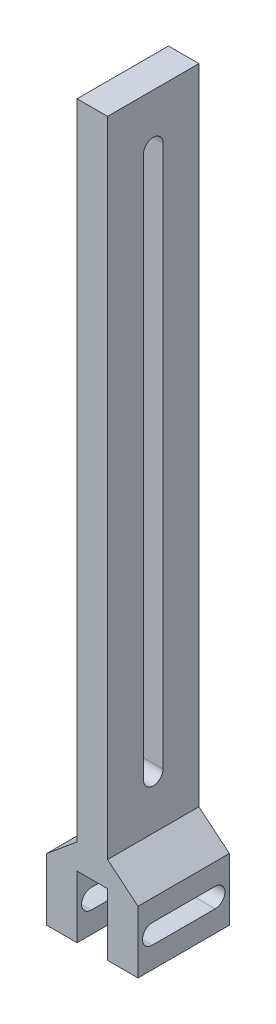
ISO-10303-21;
HEADER;
FILE_DESCRIPTION(('STEP AP214'),'2;1');
FILE_NAME('part.step','',(''),(''),'','','');
FILE_SCHEMA(('AUTOMOTIVE_DESIGN { 1 0 10303 214 1 1 1 1 }'));
ENDSEC;
DATA;
#1=APPLICATION_CONTEXT('core data for automotive mechanical design processes');
#2=APPLICATION_PROTOCOL_DEFINITION('international standard','automotive_design',2000,#1);
#3=PRODUCT_CONTEXT('',#1,'mechanical');
#4=PRODUCT('Part','Part','',(#3));
#5=PRODUCT_RELATED_PRODUCT_CATEGORY('part','',(#4));
#6=PRODUCT_DEFINITION_FORMATION('','',#4);
#7=PRODUCT_DEFINITION_CONTEXT('part definition',#1,'design');
#8=PRODUCT_DEFINITION('design','',#6,#7);
#9=PRODUCT_DEFINITION_SHAPE('','',#8);
#10=(LENGTH_UNIT() NAMED_UNIT(*) SI_UNIT(.MILLI.,.METRE.));
#11=(NAMED_UNIT(*) PLANE_ANGLE_UNIT() SI_UNIT($,.RADIAN.));
#12=(NAMED_UNIT(*) SI_UNIT($,.STERADIAN.) SOLID_ANGLE_UNIT());
#13=UNCERTAINTY_MEASURE_WITH_UNIT(LENGTH_MEASURE(1.E-05),#10,'distance_accuracy_value','');
#14=(GEOMETRIC_REPRESENTATION_CONTEXT(3) GLOBAL_UNCERTAINTY_ASSIGNED_CONTEXT((#13)) GLOBAL_UNIT_ASSIGNED_CONTEXT((#10,
#11,#12)) REPRESENTATION_CONTEXT('',''));
#15=CARTESIAN_POINT('',(0.,0.,0.));
#16=DIRECTION('',(0.,0.,1.));
#17=DIRECTION('',(1.,0.,0.));
#18=AXIS2_PLACEMENT_3D('',#15,#16,#17);
#19=CARTESIAN_POINT('',(-7.5,0.,7.5));
#20=DIRECTION('',(1.,0.,0.));
#21=DIRECTION('',(0.,0.,-1.));
#22=AXIS2_PLACEMENT_3D('',#19,#20,#21);
#23=PLANE('',#22);
#24=DIRECTION('',(0.,0.,1.));
#25=VECTOR('',#24,1.);
#26=CARTESIAN_POINT('',(-7.5,3.5,-5.16429513278029));
#27=LINE('',#26,#25);
#28=CARTESIAN_POINT('',(-7.5,3.5,-5.16429513278029));
#29=VERTEX_POINT('',#28);
#30=CARTESIAN_POINT('',(-7.5,3.5,5.16429513278028));
#31=VERTEX_POINT('',#30);
#32=EDGE_CURVE('E237',#29,#31,#27,.T.);
#33=ORIENTED_EDGE('',*,*,#32,.F.);
#34=CARTESIAN_POINT('',(-7.5,5.1,-5.16429513278029));
#35=DIRECTION('',(-1.,0.,0.));
#36=DIRECTION('',(0.,0.,1.));
#37=AXIS2_PLACEMENT_3D('',#34,#35,#36);
#38=CIRCLE('',#37,1.6);
#39=CARTESIAN_POINT('',(-7.5,6.7,-5.16429513278029));
#40=VERTEX_POINT('',#39);
#41=EDGE_CURVE('E235',#40,#29,#38,.T.);
#42=ORIENTED_EDGE('',*,*,#41,.F.);
#43=DIRECTION('',(0.,0.,-1.));
#44=VECTOR('',#43,1.);
#45=CARTESIAN_POINT('',(-7.5,6.7,-5.16429513278029));
#46=LINE('',#45,#44);
#47=CARTESIAN_POINT('',(-7.5,6.7,5.16429513278028));
#48=VERTEX_POINT('',#47);
#49=EDGE_CURVE('E243',#48,#40,#46,.T.);
#50=ORIENTED_EDGE('',*,*,#49,.F.);
#51=CARTESIAN_POINT('',(-7.5,5.1,5.16429513278029));
#52=DIRECTION('',(-1.,0.,0.));
#53=DIRECTION('',(0.,0.,1.));
#54=AXIS2_PLACEMENT_3D('',#51,#52,#53);
#55=CIRCLE('',#54,1.6);
#56=EDGE_CURVE('E240',#31,#48,#55,.T.);
#57=ORIENTED_EDGE('',*,*,#56,.F.);
#58=EDGE_LOOP('',(#33,#42,#50,#57));
#59=FACE_BOUND('',#58,.T.);
#60=DIRECTION('',(0.,-1.,0.));
#61=VECTOR('',#60,1.);
#62=CARTESIAN_POINT('',(-7.5,0.,-7.5));
#63=LINE('',#62,#61);
#64=CARTESIAN_POINT('',(-7.5,10.2,-7.5));
#65=VERTEX_POINT('',#64);
#66=CARTESIAN_POINT('',(-7.5,0.,-7.5));
#67=VERTEX_POINT('',#66);
#68=EDGE_CURVE('E283',#65,#67,#63,.T.);
#69=ORIENTED_EDGE('',*,*,#68,.T.);
#70=DIRECTION('',(0.,0.,-1.));
#71=VECTOR('',#70,1.);
#72=CARTESIAN_POINT('',(-7.5,0.,7.5));
#73=LINE('',#72,#71);
#74=CARTESIAN_POINT('',(-7.5,0.,7.5));
#75=VERTEX_POINT('',#74);
#76=EDGE_CURVE('E366',#75,#67,#73,.T.);
#77=ORIENTED_EDGE('',*,*,#76,.F.);
#78=DIRECTION('',(0.,-1.,0.));
#79=VECTOR('',#78,1.);
#80=CARTESIAN_POINT('',(-7.5,0.,7.5));
#81=LINE('',#80,#79);
#82=CARTESIAN_POINT('',(-7.5,10.2,7.5));
#83=VERTEX_POINT('',#82);
#84=EDGE_CURVE('E284',#83,#75,#81,.T.);
#85=ORIENTED_EDGE('',*,*,#84,.F.);
#86=DIRECTION('',(0.,0.,-1.));
#87=VECTOR('',#86,1.);
#88=CARTESIAN_POINT('',(-7.5,10.2,7.5));
#89=LINE('',#88,#87);
#90=EDGE_CURVE('E310',#83,#65,#89,.T.);
#91=ORIENTED_EDGE('',*,*,#90,.T.);
#92=EDGE_LOOP('',(#69,#77,#85,#91));
#93=FACE_BOUND('',#92,.T.);
#94=ADVANCED_FACE('F38',(#59,#93),#23,.F.);
#95=CARTESIAN_POINT('',(-7.5,0.,7.5));
#96=DIRECTION('',(0.,1.,0.));
#97=DIRECTION('',(0.,0.,1.));
#98=AXIS2_PLACEMENT_3D('',#95,#96,#97);
#99=PLANE('',#98);
#100=DIRECTION('',(1.,0.,0.));
#101=VECTOR('',#100,1.);
#102=CARTESIAN_POINT('',(-7.5,0.,-7.5));
#103=LINE('',#102,#101);
#104=CARTESIAN_POINT('',(-2.5,0.,-7.5));
#105=VERTEX_POINT('',#104);
#106=EDGE_CURVE('E313',#67,#105,#103,.T.);
#107=ORIENTED_EDGE('',*,*,#106,.T.);
#108=DIRECTION('',(0.,0.,-1.));
#109=VECTOR('',#108,1.);
#110=CARTESIAN_POINT('',(-2.5,0.,7.5));
#111=LINE('',#110,#109);
#112=CARTESIAN_POINT('',(-2.5,0.,7.5));
#113=VERTEX_POINT('',#112);
#114=EDGE_CURVE('E363',#113,#105,#111,.T.);
#115=ORIENTED_EDGE('',*,*,#114,.F.);
#116=DIRECTION('',(1.,0.,0.));
#117=VECTOR('',#116,1.);
#118=CARTESIAN_POINT('',(-7.5,0.,7.5));
#119=LINE('',#118,#117);
#120=EDGE_CURVE('E287',#75,#113,#119,.T.);
#121=ORIENTED_EDGE('',*,*,#120,.F.);
#122=ORIENTED_EDGE('',*,*,#76,.T.);
#123=EDGE_LOOP('',(#107,#115,#121,#122));
#124=FACE_BOUND('',#123,.T.);
#125=ADVANCED_FACE('F416',(#124),#99,.F.);
#126=CARTESIAN_POINT('',(-2.5,0.,7.5));
#127=DIRECTION('',(-1.,0.,0.));
#128=DIRECTION('',(0.,0.,1.));
#129=AXIS2_PLACEMENT_3D('',#126,#127,#128);
#130=PLANE('',#129);
#131=DIRECTION('',(0.,0.,-1.));
#132=VECTOR('',#131,1.);
#133=CARTESIAN_POINT('',(-2.5,6.7,7.5));
#134=LINE('',#133,#132);
#135=CARTESIAN_POINT('',(-2.5,6.7,5.16429513278028));
#136=VERTEX_POINT('',#135);
#137=CARTESIAN_POINT('',(-2.5,6.7,-5.16429513278029));
#138=VERTEX_POINT('',#137);
#139=EDGE_CURVE('E274',#136,#138,#134,.T.);
#140=ORIENTED_EDGE('',*,*,#139,.T.);
#141=CARTESIAN_POINT('',(-2.5,5.1,-5.16429513278029));
#142=DIRECTION('',(-1.,0.,0.));
#143=DIRECTION('',(0.,0.,1.));
#144=AXIS2_PLACEMENT_3D('',#141,#142,#143);
#145=CIRCLE('',#144,1.6);
#146=CARTESIAN_POINT('',(-2.5,3.5,-5.16429513278029));
#147=VERTEX_POINT('',#146);
#148=EDGE_CURVE('E280',#138,#147,#145,.T.);
#149=ORIENTED_EDGE('',*,*,#148,.T.);
#150=DIRECTION('',(0.,0.,1.));
#151=VECTOR('',#150,1.);
#152=CARTESIAN_POINT('',(-2.5,3.5,7.5));
#153=LINE('',#152,#151);
#154=CARTESIAN_POINT('',(-2.5,3.5,5.16429513278028));
#155=VERTEX_POINT('',#154);
#156=EDGE_CURVE('E262',#147,#155,#153,.T.);
#157=ORIENTED_EDGE('',*,*,#156,.T.);
#158=CARTESIAN_POINT('',(-2.5,5.1,5.16429513278029));
#159=DIRECTION('',(-1.,0.,0.));
#160=DIRECTION('',(0.,0.,1.));
#161=AXIS2_PLACEMENT_3D('',#158,#159,#160);
#162=CIRCLE('',#161,1.6);
#163=EDGE_CURVE('E268',#155,#136,#162,.T.);
#164=ORIENTED_EDGE('',*,*,#163,.T.);
#165=EDGE_LOOP('',(#140,#149,#157,#164));
#166=FACE_BOUND('',#165,.T.);
#167=DIRECTION('',(0.,1.,0.));
#168=VECTOR('',#167,1.);
#169=CARTESIAN_POINT('',(-2.5,0.,-7.5));
#170=LINE('',#169,#168);
#171=CARTESIAN_POINT('',(-2.5,10.2,-7.5));
#172=VERTEX_POINT('',#171);
#173=EDGE_CURVE('E315',#105,#172,#170,.T.);
#174=ORIENTED_EDGE('',*,*,#173,.T.);
#175=DIRECTION('',(0.,0.,-1.));
#176=VECTOR('',#175,1.);
#177=CARTESIAN_POINT('',(-2.5,10.2,7.5));
#178=LINE('',#177,#176);
#179=CARTESIAN_POINT('',(-2.5,10.2,7.5));
#180=VERTEX_POINT('',#179);
#181=EDGE_CURVE('E360',#180,#172,#178,.T.);
#182=ORIENTED_EDGE('',*,*,#181,.F.);
#183=DIRECTION('',(0.,1.,0.));
#184=VECTOR('',#183,1.);
#185=CARTESIAN_POINT('',(-2.5,0.,7.5));
#186=LINE('',#185,#184);
#187=EDGE_CURVE('E290',#113,#180,#186,.T.);
#188=ORIENTED_EDGE('',*,*,#187,.F.);
#189=ORIENTED_EDGE('',*,*,#114,.T.);
#190=EDGE_LOOP('',(#174,#182,#188,#189));
#191=FACE_BOUND('',#190,.T.);
#192=ADVANCED_FACE('F422',(#166,#191),#130,.F.);
#193=CARTESIAN_POINT('',(-2.5,10.2,7.5));
#194=DIRECTION('',(0.,1.,0.));
#195=DIRECTION('',(0.,0.,1.));
#196=AXIS2_PLACEMENT_3D('',#193,#194,#195);
#197=PLANE('',#196);
#198=DIRECTION('',(1.,0.,0.));
#199=VECTOR('',#198,1.);
#200=CARTESIAN_POINT('',(-2.5,10.2,-7.5));
#201=LINE('',#200,#199);
#202=CARTESIAN_POINT('',(2.5,10.2,-7.5));
#203=VERTEX_POINT('',#202);
#204=EDGE_CURVE('E317',#172,#203,#201,.T.);
#205=ORIENTED_EDGE('',*,*,#204,.T.);
#206=DIRECTION('',(0.,0.,-1.));
#207=VECTOR('',#206,1.);
#208=CARTESIAN_POINT('',(2.5,10.2,7.5));
#209=LINE('',#208,#207);
#210=CARTESIAN_POINT('',(2.5,10.2,7.5));
#211=VERTEX_POINT('',#210);
#212=EDGE_CURVE('E357',#211,#203,#209,.T.);
#213=ORIENTED_EDGE('',*,*,#212,.F.);
#214=DIRECTION('',(1.,0.,0.));
#215=VECTOR('',#214,1.);
#216=CARTESIAN_POINT('',(-2.5,10.2,7.5));
#217=LINE('',#216,#215);
#218=EDGE_CURVE('E292',#180,#211,#217,.T.);
#219=ORIENTED_EDGE('',*,*,#218,.F.);
#220=ORIENTED_EDGE('',*,*,#181,.T.);
#221=EDGE_LOOP('',(#205,#213,#219,#220));
#222=FACE_BOUND('',#221,.T.);
#223=ADVANCED_FACE('F472',(#222),#197,.F.);
#224=CARTESIAN_POINT('',(2.5,10.2,7.5));
#225=DIRECTION('',(1.,0.,0.));
#226=DIRECTION('',(0.,0.,-1.));
#227=AXIS2_PLACEMENT_3D('',#224,#225,#226);
#228=PLANE('',#227);
#229=DIRECTION('',(0.,0.,-1.));
#230=VECTOR('',#229,1.);
#231=CARTESIAN_POINT('',(2.5,3.5,7.5));
#232=LINE('',#231,#230);
#233=CARTESIAN_POINT('',(2.5,3.5,5.16429513278028));
#234=VERTEX_POINT('',#233);
#235=CARTESIAN_POINT('',(2.5,3.5,-5.16429513278029));
#236=VERTEX_POINT('',#235);
#237=EDGE_CURVE('E259',#234,#236,#232,.T.);
#238=ORIENTED_EDGE('',*,*,#237,.T.);
#239=CARTESIAN_POINT('',(2.5,5.1,-5.16429513278029));
#240=DIRECTION('',(1.,0.,0.));
#241=DIRECTION('',(0.,0.,-1.));
#242=AXIS2_PLACEMENT_3D('',#239,#240,#241);
#243=CIRCLE('',#242,1.6);
#244=CARTESIAN_POINT('',(2.5,6.7,-5.16429513278029));
#245=VERTEX_POINT('',#244);
#246=EDGE_CURVE('E277',#236,#245,#243,.T.);
#247=ORIENTED_EDGE('',*,*,#246,.T.);
#248=DIRECTION('',(0.,0.,1.));
#249=VECTOR('',#248,1.);
#250=CARTESIAN_POINT('',(2.5,6.7,7.5));
#251=LINE('',#250,#249);
#252=CARTESIAN_POINT('',(2.5,6.7,5.16429513278028));
#253=VERTEX_POINT('',#252);
#254=EDGE_CURVE('E271',#245,#253,#251,.T.);
#255=ORIENTED_EDGE('',*,*,#254,.T.);
#256=CARTESIAN_POINT('',(2.5,5.1,5.16429513278029));
#257=DIRECTION('',(1.,0.,0.));
#258=DIRECTION('',(0.,0.,-1.));
#259=AXIS2_PLACEMENT_3D('',#256,#257,#258);
#260=CIRCLE('',#259,1.6);
#261=EDGE_CURVE('E265',#253,#234,#260,.T.);
#262=ORIENTED_EDGE('',*,*,#261,.T.);
#263=EDGE_LOOP('',(#238,#247,#255,#262));
#264=FACE_BOUND('',#263,.T.);
#265=DIRECTION('',(0.,-1.,0.));
#266=VECTOR('',#265,1.);
#267=CARTESIAN_POINT('',(2.5,10.2,-7.5));
#268=LINE('',#267,#266);
#269=CARTESIAN_POINT('',(2.5,0.,-7.5));
#270=VERTEX_POINT('',#269);
#271=EDGE_CURVE('E319',#203,#270,#268,.T.);
#272=ORIENTED_EDGE('',*,*,#271,.T.);
#273=DIRECTION('',(0.,0.,-1.));
#274=VECTOR('',#273,1.);
#275=CARTESIAN_POINT('',(2.5,0.,7.5));
#276=LINE('',#275,#274);
#277=CARTESIAN_POINT('',(2.5,0.,7.5));
#278=VERTEX_POINT('',#277);
#279=EDGE_CURVE('E354',#278,#270,#276,.T.);
#280=ORIENTED_EDGE('',*,*,#279,.F.);
#281=DIRECTION('',(0.,-1.,0.));
#282=VECTOR('',#281,1.);
#283=CARTESIAN_POINT('',(2.5,10.2,7.5));
#284=LINE('',#283,#282);
#285=EDGE_CURVE('E294',#211,#278,#284,.T.);
#286=ORIENTED_EDGE('',*,*,#285,.F.);
#287=ORIENTED_EDGE('',*,*,#212,.T.);
#288=EDGE_LOOP('',(#272,#280,#286,#287));
#289=FACE_BOUND('',#288,.T.);
#290=ADVANCED_FACE('F389',(#264,#289),#228,.F.);
#291=CARTESIAN_POINT('',(7.5,0.,7.5));
#292=DIRECTION('',(0.,1.,0.));
#293=DIRECTION('',(0.,0.,1.));
#294=AXIS2_PLACEMENT_3D('',#291,#292,#293);
#295=PLANE('',#294);
#296=DIRECTION('',(1.,0.,0.));
#297=VECTOR('',#296,1.);
#298=CARTESIAN_POINT('',(7.5,0.,-7.5));
#299=LINE('',#298,#297);
#300=CARTESIAN_POINT('',(7.5,0.,-7.5));
#301=VERTEX_POINT('',#300);
#302=EDGE_CURVE('E321',#270,#301,#299,.T.);
#303=ORIENTED_EDGE('',*,*,#302,.T.);
#304=DIRECTION('',(0.,0.,-1.));
#305=VECTOR('',#304,1.);
#306=CARTESIAN_POINT('',(7.5,0.,7.5));
#307=LINE('',#306,#305);
#308=CARTESIAN_POINT('',(7.5,0.,7.5));
#309=VERTEX_POINT('',#308);
#310=EDGE_CURVE('E351',#309,#301,#307,.T.);
#311=ORIENTED_EDGE('',*,*,#310,.F.);
#312=DIRECTION('',(1.,0.,0.));
#313=VECTOR('',#312,1.);
#314=CARTESIAN_POINT('',(7.5,0.,7.5));
#315=LINE('',#314,#313);
#316=EDGE_CURVE('E296',#278,#309,#315,.T.);
#317=ORIENTED_EDGE('',*,*,#316,.F.);
#318=ORIENTED_EDGE('',*,*,#279,.T.);
#319=EDGE_LOOP('',(#303,#311,#317,#318));
#320=FACE_BOUND('',#319,.T.);
#321=ADVANCED_FACE('F467',(#320),#295,.F.);
#322=CARTESIAN_POINT('',(7.5,10.2,7.5));
#323=DIRECTION('',(-1.,0.,0.));
#324=DIRECTION('',(0.,0.,1.));
#325=AXIS2_PLACEMENT_3D('',#322,#323,#324);
#326=PLANE('',#325);
#327=DIRECTION('',(0.,0.,-1.));
#328=VECTOR('',#327,1.);
#329=CARTESIAN_POINT('',(7.5,6.7,7.5));
#330=LINE('',#329,#328);
#331=CARTESIAN_POINT('',(7.5,6.7,5.16429513278028));
#332=VERTEX_POINT('',#331);
#333=CARTESIAN_POINT('',(7.5,6.7,-5.16429513278029));
#334=VERTEX_POINT('',#333);
#335=EDGE_CURVE('E45',#332,#334,#330,.T.);
#336=ORIENTED_EDGE('',*,*,#335,.T.);
#337=CARTESIAN_POINT('',(7.5,5.1,-5.16429513278029));
#338=DIRECTION('',(-1.,0.,0.));
#339=DIRECTION('',(0.,0.,1.));
#340=AXIS2_PLACEMENT_3D('',#337,#338,#339);
#341=CIRCLE('',#340,1.6);
#342=CARTESIAN_POINT('',(7.5,3.5,-5.16429513278029));
#343=VERTEX_POINT('',#342);
#344=EDGE_CURVE('E11',#334,#343,#341,.T.);
#345=ORIENTED_EDGE('',*,*,#344,.T.);
#346=DIRECTION('',(0.,0.,1.));
#347=VECTOR('',#346,1.);
#348=CARTESIAN_POINT('',(7.5,3.5,7.5));
#349=LINE('',#348,#347);
#350=CARTESIAN_POINT('',(7.5,3.5,5.16429513278028));
#351=VERTEX_POINT('',#350);
#352=EDGE_CURVE('E369',#343,#351,#349,.T.);
#353=ORIENTED_EDGE('',*,*,#352,.T.);
#354=CARTESIAN_POINT('',(7.5,5.1,5.16429513278029));
#355=DIRECTION('',(-1.,0.,0.));
#356=DIRECTION('',(0.,0.,1.));
#357=AXIS2_PLACEMENT_3D('',#354,#355,#356);
#358=CIRCLE('',#357,1.6);
#359=EDGE_CURVE('E372',#351,#332,#358,.T.);
#360=ORIENTED_EDGE('',*,*,#359,.T.);
#361=EDGE_LOOP('',(#336,#345,#353,#360));
#362=FACE_BOUND('',#361,.T.);
#363=DIRECTION('',(0.,1.,0.));
#364=VECTOR('',#363,1.);
#365=CARTESIAN_POINT('',(7.5,10.2,-7.5));
#366=LINE('',#365,#364);
#367=CARTESIAN_POINT('',(7.5,10.2,-7.5));
#368=VERTEX_POINT('',#367);
#369=EDGE_CURVE('E323',#301,#368,#366,.T.);
#370=ORIENTED_EDGE('',*,*,#369,.T.);
#371=DIRECTION('',(0.,0.,-1.));
#372=VECTOR('',#371,1.);
#373=CARTESIAN_POINT('',(7.5,10.2,7.5));
#374=LINE('',#373,#372);
#375=CARTESIAN_POINT('',(7.5,10.2,7.5));
#376=VERTEX_POINT('',#375);
#377=EDGE_CURVE('E348',#376,#368,#374,.T.);
#378=ORIENTED_EDGE('',*,*,#377,.F.);
#379=DIRECTION('',(0.,1.,0.));
#380=VECTOR('',#379,1.);
#381=CARTESIAN_POINT('',(7.5,10.2,7.5));
#382=LINE('',#381,#380);
#383=EDGE_CURVE('E298',#309,#376,#382,.T.);
#384=ORIENTED_EDGE('',*,*,#383,.F.);
#385=ORIENTED_EDGE('',*,*,#310,.T.);
#386=EDGE_LOOP('',(#370,#378,#384,#385));
#387=FACE_BOUND('',#386,.T.);
#388=ADVANCED_FACE('F376',(#362,#387),#326,.F.);
#389=CARTESIAN_POINT('',(2.5,14.3418605701155,7.5));
#390=DIRECTION('',(-0.637926850070141,-0.770096963998423,0.));
#391=DIRECTION('',(0.770096963998423,-0.637926850070141,0.));
#392=AXIS2_PLACEMENT_3D('',#389,#390,#391);
#393=PLANE('',#392);
#394=DIRECTION('',(-0.770096963998423,0.637926850070141,0.));
#395=VECTOR('',#394,1.);
#396=CARTESIAN_POINT('',(2.5,14.3418605701155,-7.5));
#397=LINE('',#396,#395);
#398=CARTESIAN_POINT('',(2.5,14.3418605701155,-7.5));
#399=VERTEX_POINT('',#398);
#400=EDGE_CURVE('E325',#368,#399,#397,.T.);
#401=ORIENTED_EDGE('',*,*,#400,.T.);
#402=DIRECTION('',(0.,0.,-1.));
#403=VECTOR('',#402,1.);
#404=CARTESIAN_POINT('',(2.5,14.3418605701155,7.5));
#405=LINE('',#404,#403);
#406=CARTESIAN_POINT('',(2.5,14.3418605701155,7.5));
#407=VERTEX_POINT('',#406);
#408=EDGE_CURVE('E345',#407,#399,#405,.T.);
#409=ORIENTED_EDGE('',*,*,#408,.F.);
#410=DIRECTION('',(-0.770096963998423,0.637926850070141,0.));
#411=VECTOR('',#410,1.);
#412=CARTESIAN_POINT('',(2.5,14.3418605701155,7.5));
#413=LINE('',#412,#411);
#414=EDGE_CURVE('E300',#376,#407,#413,.T.);
#415=ORIENTED_EDGE('',*,*,#414,.F.);
#416=ORIENTED_EDGE('',*,*,#377,.T.);
#417=EDGE_LOOP('',(#401,#409,#415,#416));
#418=FACE_BOUND('',#417,.T.);
#419=ADVANCED_FACE('F458',(#418),#393,.F.);
#420=CARTESIAN_POINT('',(2.49999999999999,120.,7.5));
#421=DIRECTION('',(-1.,0.,0.));
#422=DIRECTION('',(0.,-1.,0.));
#423=AXIS2_PLACEMENT_3D('',#420,#421,#422);
#424=PLANE('',#423);
#425=DIRECTION('',(0.,-1.,0.));
#426=VECTOR('',#425,1.);
#427=CARTESIAN_POINT('',(2.49999999999999,120.,-1.60000000000002));
#428=LINE('',#427,#426);
#429=CARTESIAN_POINT('',(2.49999999999998,111.667888003961,-1.60000000000002));
#430=VERTEX_POINT('',#429);
#431=CARTESIAN_POINT('',(2.49999999999999,22.6739725661542,-1.59999999999999));
#432=VERTEX_POINT('',#431);
#433=EDGE_CURVE('E229',#430,#432,#428,.T.);
#434=ORIENTED_EDGE('',*,*,#433,.T.);
#435=CARTESIAN_POINT('',(2.5,22.6739725661542,0.));
#436=DIRECTION('',(-1.,0.,0.));
#437=DIRECTION('',(0.,-1.,0.));
#438=AXIS2_PLACEMENT_3D('',#435,#436,#437);
#439=CIRCLE('',#438,1.6);
#440=CARTESIAN_POINT('',(2.49999999999999,22.6739725661542,1.60000000000001));
#441=VERTEX_POINT('',#440);
#442=EDGE_CURVE('E232',#432,#441,#439,.T.);
#443=ORIENTED_EDGE('',*,*,#442,.T.);
#444=DIRECTION('',(0.,1.,0.));
#445=VECTOR('',#444,1.);
#446=CARTESIAN_POINT('',(2.49999999999999,120.,1.59999999999998));
#447=LINE('',#446,#445);
#448=CARTESIAN_POINT('',(2.49999999999999,111.667888003961,1.59999999999999));
#449=VERTEX_POINT('',#448);
#450=EDGE_CURVE('E224',#441,#449,#447,.T.);
#451=ORIENTED_EDGE('',*,*,#450,.T.);
#452=CARTESIAN_POINT('',(2.49999999999998,111.667888003961,0.));
#453=DIRECTION('',(-1.,0.,0.));
#454=DIRECTION('',(0.,-1.,0.));
#455=AXIS2_PLACEMENT_3D('',#452,#453,#454);
#456=CIRCLE('',#455,1.6);
#457=EDGE_CURVE('E204',#449,#430,#456,.T.);
#458=ORIENTED_EDGE('',*,*,#457,.T.);
#459=EDGE_LOOP('',(#434,#443,#451,#458));
#460=FACE_BOUND('',#459,.T.);
#461=DIRECTION('',(0.,1.,0.));
#462=VECTOR('',#461,1.);
#463=CARTESIAN_POINT('',(2.49999999999999,120.,-7.5));
#464=LINE('',#463,#462);
#465=CARTESIAN_POINT('',(2.49999999999999,120.,-7.5));
#466=VERTEX_POINT('',#465);
#467=EDGE_CURVE('E327',#399,#466,#464,.T.);
#468=ORIENTED_EDGE('',*,*,#467,.T.);
#469=DIRECTION('',(0.,0.,-1.));
#470=VECTOR('',#469,1.);
#471=CARTESIAN_POINT('',(2.49999999999999,120.,7.5));
#472=LINE('',#471,#470);
#473=CARTESIAN_POINT('',(2.49999999999999,120.,7.5));
#474=VERTEX_POINT('',#473);
#475=EDGE_CURVE('E342',#474,#466,#472,.T.);
#476=ORIENTED_EDGE('',*,*,#475,.F.);
#477=DIRECTION('',(0.,1.,0.));
#478=VECTOR('',#477,1.);
#479=CARTESIAN_POINT('',(2.49999999999999,120.,7.5));
#480=LINE('',#479,#478);
#481=EDGE_CURVE('E302',#407,#474,#480,.T.);
#482=ORIENTED_EDGE('',*,*,#481,.F.);
#483=ORIENTED_EDGE('',*,*,#408,.T.);
#484=EDGE_LOOP('',(#468,#476,#482,#483));
#485=FACE_BOUND('',#484,.T.);
#486=ADVANCED_FACE('F454',(#460,#485),#424,.F.);
#487=CARTESIAN_POINT('',(-2.5,120.,7.5));
#488=DIRECTION('',(0.,-1.,0.));
#489=DIRECTION('',(0.,0.,-1.));
#490=AXIS2_PLACEMENT_3D('',#487,#488,#489);
#491=PLANE('',#490);
#492=DIRECTION('',(-1.,0.,0.));
#493=VECTOR('',#492,1.);
#494=CARTESIAN_POINT('',(-2.5,120.,-7.5));
#495=LINE('',#494,#493);
#496=CARTESIAN_POINT('',(-2.5,120.,-7.5));
#497=VERTEX_POINT('',#496);
#498=EDGE_CURVE('E329',#466,#497,#495,.T.);
#499=ORIENTED_EDGE('',*,*,#498,.T.);
#500=DIRECTION('',(0.,0.,-1.));
#501=VECTOR('',#500,1.);
#502=CARTESIAN_POINT('',(-2.5,120.,7.5));
#503=LINE('',#502,#501);
#504=CARTESIAN_POINT('',(-2.5,120.,7.5));
#505=VERTEX_POINT('',#504);
#506=EDGE_CURVE('E339',#505,#497,#503,.T.);
#507=ORIENTED_EDGE('',*,*,#506,.F.);
#508=DIRECTION('',(-1.,0.,0.));
#509=VECTOR('',#508,1.);
#510=CARTESIAN_POINT('',(-2.5,120.,7.5));
#511=LINE('',#510,#509);
#512=EDGE_CURVE('E304',#474,#505,#511,.T.);
#513=ORIENTED_EDGE('',*,*,#512,.F.);
#514=ORIENTED_EDGE('',*,*,#475,.T.);
#515=EDGE_LOOP('',(#499,#507,#513,#514));
#516=FACE_BOUND('',#515,.T.);
#517=ADVANCED_FACE('F449',(#516),#491,.F.);
#518=CARTESIAN_POINT('',(-2.5,14.3418605701155,7.5));
#519=DIRECTION('',(1.,0.,0.));
#520=DIRECTION('',(0.,0.,-1.));
#521=AXIS2_PLACEMENT_3D('',#518,#519,#520);
#522=PLANE('',#521);
#523=DIRECTION('',(0.,1.,0.));
#524=VECTOR('',#523,1.);
#525=CARTESIAN_POINT('',(-2.5,22.6739725661542,1.60000000000001));
#526=LINE('',#525,#524);
#527=CARTESIAN_POINT('',(-2.5,22.6739725661542,1.60000000000001));
#528=VERTEX_POINT('',#527);
#529=CARTESIAN_POINT('',(-2.5,111.667888003961,1.6));
#530=VERTEX_POINT('',#529);
#531=EDGE_CURVE('E210',#528,#530,#526,.T.);
#532=ORIENTED_EDGE('',*,*,#531,.F.);
#533=CARTESIAN_POINT('',(-2.5,22.6739725661542,0.));
#534=DIRECTION('',(-1.,0.,0.));
#535=DIRECTION('',(0.,0.,1.));
#536=AXIS2_PLACEMENT_3D('',#533,#534,#535);
#537=CIRCLE('',#536,1.6);
#538=CARTESIAN_POINT('',(-2.5,22.6739725661542,-1.59999999999999));
#539=VERTEX_POINT('',#538);
#540=EDGE_CURVE('E60',#539,#528,#537,.T.);
#541=ORIENTED_EDGE('',*,*,#540,.F.);
#542=DIRECTION('',(0.,-1.,0.));
#543=VECTOR('',#542,1.);
#544=CARTESIAN_POINT('',(-2.5,22.6739725661542,-1.59999999999999));
#545=LINE('',#544,#543);
#546=CARTESIAN_POINT('',(-2.5,111.667888003961,-1.60000000000002));
#547=VERTEX_POINT('',#546);
#548=EDGE_CURVE('E217',#547,#539,#545,.T.);
#549=ORIENTED_EDGE('',*,*,#548,.F.);
#550=CARTESIAN_POINT('',(-2.5,111.667888003961,0.));
#551=DIRECTION('',(-1.,0.,0.));
#552=DIRECTION('',(0.,0.,1.));
#553=AXIS2_PLACEMENT_3D('',#550,#551,#552);
#554=CIRCLE('',#553,1.6);
#555=EDGE_CURVE('E201',#530,#547,#554,.T.);
#556=ORIENTED_EDGE('',*,*,#555,.F.);
#557=EDGE_LOOP('',(#532,#541,#549,#556));
#558=FACE_BOUND('',#557,.T.);
#559=DIRECTION('',(0.,-1.,0.));
#560=VECTOR('',#559,1.);
#561=CARTESIAN_POINT('',(-2.5,14.3418605701155,-7.5));
#562=LINE('',#561,#560);
#563=CARTESIAN_POINT('',(-2.5,14.3418605701155,-7.5));
#564=VERTEX_POINT('',#563);
#565=EDGE_CURVE('E331',#497,#564,#562,.T.);
#566=ORIENTED_EDGE('',*,*,#565,.T.);
#567=DIRECTION('',(0.,0.,-1.));
#568=VECTOR('',#567,1.);
#569=CARTESIAN_POINT('',(-2.5,14.3418605701155,7.5));
#570=LINE('',#569,#568);
#571=CARTESIAN_POINT('',(-2.5,14.3418605701155,7.5));
#572=VERTEX_POINT('',#571);
#573=EDGE_CURVE('E336',#572,#564,#570,.T.);
#574=ORIENTED_EDGE('',*,*,#573,.F.);
#575=DIRECTION('',(0.,-1.,0.));
#576=VECTOR('',#575,1.);
#577=CARTESIAN_POINT('',(-2.5,14.3418605701155,7.5));
#578=LINE('',#577,#576);
#579=EDGE_CURVE('E306',#505,#572,#578,.T.);
#580=ORIENTED_EDGE('',*,*,#579,.F.);
#581=ORIENTED_EDGE('',*,*,#506,.T.);
#582=EDGE_LOOP('',(#566,#574,#580,#581));
#583=FACE_BOUND('',#582,.T.);
#584=ADVANCED_FACE('F214',(#558,#583),#522,.F.);
#585=CARTESIAN_POINT('',(-7.5,10.2,7.5));
#586=DIRECTION('',(0.637926850070141,-0.770096963998423,0.));
#587=DIRECTION('',(0.770096963998423,0.637926850070141,0.));
#588=AXIS2_PLACEMENT_3D('',#585,#586,#587);
#589=PLANE('',#588);
#590=DIRECTION('',(-0.770096963998423,-0.637926850070141,0.));
#591=VECTOR('',#590,1.);
#592=CARTESIAN_POINT('',(-7.5,10.2,-7.5));
#593=LINE('',#592,#591);
#594=EDGE_CURVE('E288',#564,#65,#593,.T.);
#595=ORIENTED_EDGE('',*,*,#594,.T.);
#596=ORIENTED_EDGE('',*,*,#90,.F.);
#597=DIRECTION('',(-0.770096963998423,-0.637926850070141,0.));
#598=VECTOR('',#597,1.);
#599=CARTESIAN_POINT('',(-7.5,10.2,7.5));
#600=LINE('',#599,#598);
#601=EDGE_CURVE('E308',#572,#83,#600,.T.);
#602=ORIENTED_EDGE('',*,*,#601,.F.);
#603=ORIENTED_EDGE('',*,*,#573,.T.);
#604=EDGE_LOOP('',(#595,#596,#602,#603));
#605=FACE_BOUND('',#604,.T.);
#606=ADVANCED_FACE('F443',(#605),#589,.F.);
#607=CARTESIAN_POINT('',(0.,0.,7.5));
#608=DIRECTION('',(0.,0.,-1.));
#609=DIRECTION('',(-1.,0.,0.));
#610=AXIS2_PLACEMENT_3D('',#607,#608,#609);
#611=PLANE('',#610);
#612=ORIENTED_EDGE('',*,*,#84,.T.);
#613=ORIENTED_EDGE('',*,*,#120,.T.);
#614=ORIENTED_EDGE('',*,*,#187,.T.);
#615=ORIENTED_EDGE('',*,*,#218,.T.);
#616=ORIENTED_EDGE('',*,*,#285,.T.);
#617=ORIENTED_EDGE('',*,*,#316,.T.);
#618=ORIENTED_EDGE('',*,*,#383,.T.);
#619=ORIENTED_EDGE('',*,*,#414,.T.);
#620=ORIENTED_EDGE('',*,*,#481,.T.);
#621=ORIENTED_EDGE('',*,*,#512,.T.);
#622=ORIENTED_EDGE('',*,*,#579,.T.);
#623=ORIENTED_EDGE('',*,*,#601,.T.);
#624=EDGE_LOOP('',(#612,#613,#614,#615,#616,#617,#618,#619,#620,#621,#622,#623));
#625=FACE_BOUND('',#624,.T.);
#626=ADVANCED_FACE('F408',(#625),#611,.F.);
#627=CARTESIAN_POINT('',(0.,0.,-7.5));
#628=DIRECTION('',(0.,0.,-1.));
#629=DIRECTION('',(-1.,0.,0.));
#630=AXIS2_PLACEMENT_3D('',#627,#628,#629);
#631=PLANE('',#630);
#632=ORIENTED_EDGE('',*,*,#68,.F.);
#633=ORIENTED_EDGE('',*,*,#594,.F.);
#634=ORIENTED_EDGE('',*,*,#565,.F.);
#635=ORIENTED_EDGE('',*,*,#498,.F.);
#636=ORIENTED_EDGE('',*,*,#467,.F.);
#637=ORIENTED_EDGE('',*,*,#400,.F.);
#638=ORIENTED_EDGE('',*,*,#369,.F.);
#639=ORIENTED_EDGE('',*,*,#302,.F.);
#640=ORIENTED_EDGE('',*,*,#271,.F.);
#641=ORIENTED_EDGE('',*,*,#204,.F.);
#642=ORIENTED_EDGE('',*,*,#173,.F.);
#643=ORIENTED_EDGE('',*,*,#106,.F.);
#644=EDGE_LOOP('',(#632,#633,#634,#635,#636,#637,#638,#639,#640,#641,#642,#643));
#645=FACE_BOUND('',#644,.T.);
#646=ADVANCED_FACE('F398',(#645),#631,.T.);
#647=CARTESIAN_POINT('',(17.5,3.5,-5.16429513278029));
#648=DIRECTION('',(0.,-1.,0.));
#649=DIRECTION('',(0.,0.,-1.));
#650=AXIS2_PLACEMENT_3D('',#647,#648,#649);
#651=PLANE('',#650);
#652=DIRECTION('',(-1.,0.,0.));
#653=VECTOR('',#652,1.);
#654=CARTESIAN_POINT('',(17.5,3.5,5.16429513278028));
#655=LINE('',#654,#653);
#656=EDGE_CURVE('E253',#351,#234,#655,.T.);
#657=ORIENTED_EDGE('',*,*,#656,.F.);
#658=ORIENTED_EDGE('',*,*,#352,.F.);
#659=DIRECTION('',(-1.,0.,0.));
#660=VECTOR('',#659,1.);
#661=CARTESIAN_POINT('',(17.5,3.5,-5.16429513278029));
#662=LINE('',#661,#660);
#663=EDGE_CURVE('E256',#343,#236,#662,.T.);
#664=ORIENTED_EDGE('',*,*,#663,.T.);
#665=ORIENTED_EDGE('',*,*,#237,.F.);
#666=EDGE_LOOP('',(#657,#658,#664,#665));
#667=FACE_BOUND('',#666,.T.);
#668=ADVANCED_FACE('F396',(#667),#651,.F.);
#669=CARTESIAN_POINT('',(17.5,5.1,5.16429513278029));
#670=DIRECTION('',(-1.,0.,0.));
#671=DIRECTION('',(0.,0.,1.));
#672=AXIS2_PLACEMENT_3D('',#669,#670,#671);
#673=CYLINDRICAL_SURFACE('',#672,1.6);
#674=DIRECTION('',(-1.,0.,0.));
#675=VECTOR('',#674,1.);
#676=CARTESIAN_POINT('',(17.5,6.7,5.16429513278028));
#677=LINE('',#676,#675);
#678=EDGE_CURVE('E250',#332,#253,#677,.T.);
#679=ORIENTED_EDGE('',*,*,#678,.F.);
#680=ORIENTED_EDGE('',*,*,#359,.F.);
#681=ORIENTED_EDGE('',*,*,#656,.T.);
#682=ORIENTED_EDGE('',*,*,#261,.F.);
#683=EDGE_LOOP('',(#679,#680,#681,#682));
#684=FACE_BOUND('',#683,.T.);
#685=ADVANCED_FACE('F386',(#684),#673,.F.);
#686=CARTESIAN_POINT('',(17.5,6.7,-5.16429513278029));
#687=DIRECTION('',(0.,1.,0.));
#688=DIRECTION('',(0.,0.,1.));
#689=AXIS2_PLACEMENT_3D('',#686,#687,#688);
#690=PLANE('',#689);
#691=DIRECTION('',(-1.,0.,0.));
#692=VECTOR('',#691,1.);
#693=CARTESIAN_POINT('',(17.5,6.7,-5.16429513278029));
#694=LINE('',#693,#692);
#695=EDGE_CURVE('E249',#334,#245,#694,.T.);
#696=ORIENTED_EDGE('',*,*,#695,.F.);
#697=ORIENTED_EDGE('',*,*,#335,.F.);
#698=ORIENTED_EDGE('',*,*,#678,.T.);
#699=ORIENTED_EDGE('',*,*,#254,.F.);
#700=EDGE_LOOP('',(#696,#697,#698,#699));
#701=FACE_BOUND('',#700,.T.);
#702=ADVANCED_FACE('F383',(#701),#690,.F.);
#703=CARTESIAN_POINT('',(17.5,5.1,-5.16429513278029));
#704=DIRECTION('',(-1.,0.,0.));
#705=DIRECTION('',(0.,0.,1.));
#706=AXIS2_PLACEMENT_3D('',#703,#704,#705);
#707=CYLINDRICAL_SURFACE('',#706,1.6);
#708=ORIENTED_EDGE('',*,*,#663,.F.);
#709=ORIENTED_EDGE('',*,*,#344,.F.);
#710=ORIENTED_EDGE('',*,*,#695,.T.);
#711=ORIENTED_EDGE('',*,*,#246,.F.);
#712=EDGE_LOOP('',(#708,#709,#710,#711));
#713=FACE_BOUND('',#712,.T.);
#714=ADVANCED_FACE('F394',(#713),#707,.F.);
#715=EDGE_CURVE('E247',#138,#40,#694,.T.);
#716=ORIENTED_EDGE('',*,*,#715,.T.);
#717=ORIENTED_EDGE('',*,*,#41,.T.);
#718=EDGE_CURVE('E246',#147,#29,#662,.T.);
#719=ORIENTED_EDGE('',*,*,#718,.F.);
#720=ORIENTED_EDGE('',*,*,#148,.F.);
#721=EDGE_LOOP('',(#716,#717,#719,#720));
#722=FACE_BOUND('',#721,.T.);
#723=ADVANCED_FACE('F500',(#722),#707,.F.);
#724=EDGE_CURVE('E251',#136,#48,#677,.T.);
#725=ORIENTED_EDGE('',*,*,#724,.T.);
#726=ORIENTED_EDGE('',*,*,#49,.T.);
#727=ORIENTED_EDGE('',*,*,#715,.F.);
#728=ORIENTED_EDGE('',*,*,#139,.F.);
#729=EDGE_LOOP('',(#725,#726,#727,#728));
#730=FACE_BOUND('',#729,.T.);
#731=ADVANCED_FACE('F502',(#730),#690,.F.);
#732=EDGE_CURVE('E254',#155,#31,#655,.T.);
#733=ORIENTED_EDGE('',*,*,#732,.T.);
#734=ORIENTED_EDGE('',*,*,#56,.T.);
#735=ORIENTED_EDGE('',*,*,#724,.F.);
#736=ORIENTED_EDGE('',*,*,#163,.F.);
#737=EDGE_LOOP('',(#733,#734,#735,#736));
#738=FACE_BOUND('',#737,.T.);
#739=ADVANCED_FACE('F406',(#738),#673,.F.);
#740=ORIENTED_EDGE('',*,*,#718,.T.);
#741=ORIENTED_EDGE('',*,*,#32,.T.);
#742=ORIENTED_EDGE('',*,*,#732,.F.);
#743=ORIENTED_EDGE('',*,*,#156,.F.);
#744=EDGE_LOOP('',(#740,#741,#742,#743));
#745=FACE_BOUND('',#744,.T.);
#746=ADVANCED_FACE('F400',(#745),#651,.F.);
#747=CARTESIAN_POINT('',(22.5,22.6739725661542,0.));
#748=DIRECTION('',(-1.,0.,0.));
#749=DIRECTION('',(0.,0.,1.));
#750=AXIS2_PLACEMENT_3D('',#747,#748,#749);
#751=CYLINDRICAL_SURFACE('',#750,1.6);
#752=DIRECTION('',(-1.,0.,0.));
#753=VECTOR('',#752,1.);
#754=CARTESIAN_POINT('',(22.5,22.6739725661542,-1.59999999999999));
#755=LINE('',#754,#753);
#756=EDGE_CURVE('E222',#432,#539,#755,.T.);
#757=ORIENTED_EDGE('',*,*,#756,.T.);
#758=ORIENTED_EDGE('',*,*,#540,.T.);
#759=DIRECTION('',(-1.,0.,0.));
#760=VECTOR('',#759,1.);
#761=CARTESIAN_POINT('',(22.5,22.6739725661542,1.60000000000001));
#762=LINE('',#761,#760);
#763=EDGE_CURVE('E207',#441,#528,#762,.T.);
#764=ORIENTED_EDGE('',*,*,#763,.F.);
#765=ORIENTED_EDGE('',*,*,#442,.F.);
#766=EDGE_LOOP('',(#757,#758,#764,#765));
#767=FACE_BOUND('',#766,.T.);
#768=ADVANCED_FACE('F413',(#767),#751,.F.);
#769=CARTESIAN_POINT('',(22.5,22.6739725661542,-1.59999999999999));
#770=DIRECTION('',(0.,0.,-1.));
#771=DIRECTION('',(0.,1.,0.));
#772=AXIS2_PLACEMENT_3D('',#769,#770,#771);
#773=PLANE('',#772);
#774=DIRECTION('',(-1.,0.,0.));
#775=VECTOR('',#774,1.);
#776=CARTESIAN_POINT('',(22.5,111.667888003961,-1.60000000000002));
#777=LINE('',#776,#775);
#778=EDGE_CURVE('E206',#430,#547,#777,.T.);
#779=ORIENTED_EDGE('',*,*,#778,.T.);
#780=ORIENTED_EDGE('',*,*,#548,.T.);
#781=ORIENTED_EDGE('',*,*,#756,.F.);
#782=ORIENTED_EDGE('',*,*,#433,.F.);
#783=EDGE_LOOP('',(#779,#780,#781,#782));
#784=FACE_BOUND('',#783,.T.);
#785=ADVANCED_FACE('F522',(#784),#773,.F.);
#786=CARTESIAN_POINT('',(22.5,111.667888003961,0.));
#787=DIRECTION('',(-1.,0.,0.));
#788=DIRECTION('',(0.,0.,1.));
#789=AXIS2_PLACEMENT_3D('',#786,#787,#788);
#790=CYLINDRICAL_SURFACE('',#789,1.6);
#791=DIRECTION('',(-1.,0.,0.));
#792=VECTOR('',#791,1.);
#793=CARTESIAN_POINT('',(22.5,111.667888003961,1.6));
#794=LINE('',#793,#792);
#795=EDGE_CURVE('E52',#449,#530,#794,.T.);
#796=ORIENTED_EDGE('',*,*,#795,.T.);
#797=ORIENTED_EDGE('',*,*,#555,.T.);
#798=ORIENTED_EDGE('',*,*,#778,.F.);
#799=ORIENTED_EDGE('',*,*,#457,.F.);
#800=EDGE_LOOP('',(#796,#797,#798,#799));
#801=FACE_BOUND('',#800,.T.);
#802=ADVANCED_FACE('F198',(#801),#790,.F.);
#803=CARTESIAN_POINT('',(22.5,22.6739725661542,1.60000000000001));
#804=DIRECTION('',(0.,0.,1.));
#805=DIRECTION('',(0.,-1.,0.));
#806=AXIS2_PLACEMENT_3D('',#803,#804,#805);
#807=PLANE('',#806);
#808=ORIENTED_EDGE('',*,*,#763,.T.);
#809=ORIENTED_EDGE('',*,*,#531,.T.);
#810=ORIENTED_EDGE('',*,*,#795,.F.);
#811=ORIENTED_EDGE('',*,*,#450,.F.);
#812=EDGE_LOOP('',(#808,#809,#810,#811));
#813=FACE_BOUND('',#812,.T.);
#814=ADVANCED_FACE('F211',(#813),#807,.F.);
#815=CLOSED_SHELL('',(#94,#125,#192,#223,#290,#321,#388,#419,#486,#517,#584,#606,#626,#646,#668,
#685,#702,#714,#723,#731,#739,#746,#768,#785,#802,#814));
#816=MANIFOLD_SOLID_BREP('B2',#815);
#817=ADVANCED_BREP_SHAPE_REPRESENTATION('',(#18,#816),#14);
#818=SHAPE_DEFINITION_REPRESENTATION(#9,#817);
ENDSEC;
END-ISO-10303-21;
